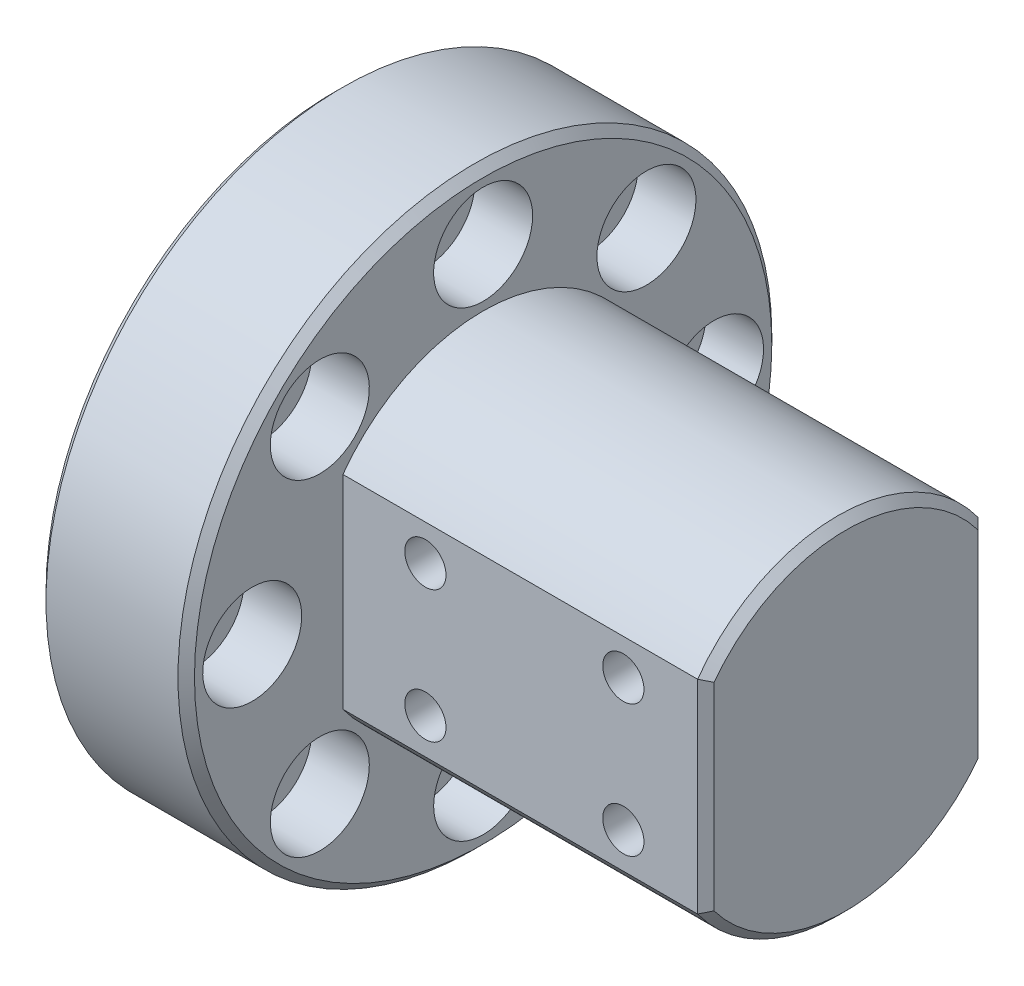
ISO-10303-21;
HEADER;
FILE_DESCRIPTION(('STEP AP214'),'2;1');
FILE_NAME('part.step','',(''),(''),'','','');
FILE_SCHEMA(('AUTOMOTIVE_DESIGN { 1 0 10303 214 1 1 1 1 }'));
ENDSEC;
DATA;
#1=APPLICATION_CONTEXT('core data for automotive mechanical design processes');
#2=APPLICATION_PROTOCOL_DEFINITION('international standard','automotive_design',2000,#1);
#3=PRODUCT_CONTEXT('',#1,'mechanical');
#4=PRODUCT('Part','Part','',(#3));
#5=PRODUCT_RELATED_PRODUCT_CATEGORY('part','',(#4));
#6=PRODUCT_DEFINITION_FORMATION('','',#4);
#7=PRODUCT_DEFINITION_CONTEXT('part definition',#1,'design');
#8=PRODUCT_DEFINITION('design','',#6,#7);
#9=PRODUCT_DEFINITION_SHAPE('','',#8);
#10=(LENGTH_UNIT() NAMED_UNIT(*) SI_UNIT(.MILLI.,.METRE.));
#11=(NAMED_UNIT(*) PLANE_ANGLE_UNIT() SI_UNIT($,.RADIAN.));
#12=(NAMED_UNIT(*) SI_UNIT($,.STERADIAN.) SOLID_ANGLE_UNIT());
#13=UNCERTAINTY_MEASURE_WITH_UNIT(LENGTH_MEASURE(1.E-05),#10,'distance_accuracy_value','');
#14=(GEOMETRIC_REPRESENTATION_CONTEXT(3) GLOBAL_UNCERTAINTY_ASSIGNED_CONTEXT((#13)) GLOBAL_UNIT_ASSIGNED_CONTEXT((#10,
#11,#12)) REPRESENTATION_CONTEXT('',''));
#15=CARTESIAN_POINT('',(0.,0.,0.));
#16=DIRECTION('',(0.,0.,1.));
#17=DIRECTION('',(1.,0.,0.));
#18=AXIS2_PLACEMENT_3D('',#15,#16,#17);
#19=CARTESIAN_POINT('',(31.,0.,0.));
#20=DIRECTION('',(-1.,0.,0.));
#21=DIRECTION('',(0.,0.,1.));
#22=AXIS2_PLACEMENT_3D('',#19,#20,#21);
#23=CYLINDRICAL_SURFACE('',#22,10.5);
#24=DIRECTION('',(-1.,0.,0.));
#25=VECTOR('',#24,1.);
#26=CARTESIAN_POINT('',(31.,-6.16441400296898,-8.5));
#27=LINE('',#26,#25);
#28=CARTESIAN_POINT('',(30.5,-6.16441400296898,-8.5));
#29=VERTEX_POINT('',#28);
#30=CARTESIAN_POINT('',(9.,-6.16441400296898,-8.5));
#31=VERTEX_POINT('',#30);
#32=EDGE_CURVE('E361',#29,#31,#27,.T.);
#33=ORIENTED_EDGE('',*,*,#32,.F.);
#34=CARTESIAN_POINT('',(30.5,0.,0.));
#35=DIRECTION('',(1.,0.,0.));
#36=DIRECTION('',(0.,0.,-1.));
#37=AXIS2_PLACEMENT_3D('',#34,#35,#36);
#38=CIRCLE('',#37,10.5);
#39=CARTESIAN_POINT('',(30.5,-6.16441400296898,8.5));
#40=VERTEX_POINT('',#39);
#41=EDGE_CURVE('E75',#29,#40,#38,.F.);
#42=ORIENTED_EDGE('',*,*,#41,.T.);
#43=DIRECTION('',(-1.,0.,0.));
#44=VECTOR('',#43,1.);
#45=CARTESIAN_POINT('',(31.,-6.16441400296898,8.5));
#46=LINE('',#45,#44);
#47=CARTESIAN_POINT('',(9.,-6.16441400296898,8.5));
#48=VERTEX_POINT('',#47);
#49=EDGE_CURVE('E112',#40,#48,#46,.T.);
#50=ORIENTED_EDGE('',*,*,#49,.T.);
#51=CARTESIAN_POINT('',(9.,0.,0.));
#52=DIRECTION('',(1.,0.,0.));
#53=DIRECTION('',(0.,0.,-1.));
#54=AXIS2_PLACEMENT_3D('',#51,#52,#53);
#55=CIRCLE('',#54,10.5);
#56=EDGE_CURVE('E120',#48,#31,#55,.T.);
#57=ORIENTED_EDGE('',*,*,#56,.T.);
#58=EDGE_LOOP('',(#33,#42,#50,#57));
#59=FACE_BOUND('',#58,.T.);
#60=ADVANCED_FACE('F45',(#59),#23,.T.);
#61=DIRECTION('',(-1.,0.,0.));
#62=VECTOR('',#61,1.);
#63=CARTESIAN_POINT('',(31.,6.16441400296898,8.5));
#64=LINE('',#63,#62);
#65=CARTESIAN_POINT('',(30.5,6.16441400296898,8.5));
#66=VERTEX_POINT('',#65);
#67=CARTESIAN_POINT('',(9.,6.16441400296898,8.5));
#68=VERTEX_POINT('',#67);
#69=EDGE_CURVE('E103',#66,#68,#64,.T.);
#70=ORIENTED_EDGE('',*,*,#69,.F.);
#71=CARTESIAN_POINT('',(30.5,0.,0.));
#72=DIRECTION('',(1.,0.,0.));
#73=DIRECTION('',(0.,0.,-1.));
#74=AXIS2_PLACEMENT_3D('',#71,#72,#73);
#75=CIRCLE('',#74,10.5);
#76=CARTESIAN_POINT('',(30.5,6.16441400296898,-8.5));
#77=VERTEX_POINT('',#76);
#78=EDGE_CURVE('E11',#66,#77,#75,.F.);
#79=ORIENTED_EDGE('',*,*,#78,.T.);
#80=DIRECTION('',(-1.,0.,0.));
#81=VECTOR('',#80,1.);
#82=CARTESIAN_POINT('',(31.,6.16441400296898,-8.5));
#83=LINE('',#82,#81);
#84=CARTESIAN_POINT('',(9.,6.16441400296898,-8.5));
#85=VERTEX_POINT('',#84);
#86=EDGE_CURVE('E121',#77,#85,#83,.T.);
#87=ORIENTED_EDGE('',*,*,#86,.T.);
#88=EDGE_CURVE('E118',#85,#68,#55,.T.);
#89=ORIENTED_EDGE('',*,*,#88,.T.);
#90=EDGE_LOOP('',(#70,#79,#87,#89));
#91=FACE_BOUND('',#90,.T.);
#92=ADVANCED_FACE('F123',(#91),#23,.T.);
#93=CARTESIAN_POINT('',(31.,0.,0.));
#94=DIRECTION('',(1.,0.,0.));
#95=DIRECTION('',(0.,0.,-1.));
#96=AXIS2_PLACEMENT_3D('',#93,#94,#95);
#97=PLANE('',#96);
#98=CARTESIAN_POINT('',(31.,0.,0.));
#99=DIRECTION('',(1.,0.,0.));
#100=DIRECTION('',(0.,0.,-1.));
#101=AXIS2_PLACEMENT_3D('',#98,#99,#100);
#102=CIRCLE('',#101,9.99999999999999);
#103=CARTESIAN_POINT('',(31.,-6.,7.99999999999999));
#104=VERTEX_POINT('',#103);
#105=CARTESIAN_POINT('',(31.,-6.,-7.99999999999999));
#106=VERTEX_POINT('',#105);
#107=EDGE_CURVE('E150',#104,#106,#102,.T.);
#108=ORIENTED_EDGE('',*,*,#107,.T.);
#109=DIRECTION('',(0.,1.,0.));
#110=VECTOR('',#109,1.);
#111=CARTESIAN_POINT('',(31.,0.,-7.99999999999999));
#112=LINE('',#111,#110);
#113=CARTESIAN_POINT('',(31.,6.,-7.99999999999999));
#114=VERTEX_POINT('',#113);
#115=EDGE_CURVE('E152',#106,#114,#112,.T.);
#116=ORIENTED_EDGE('',*,*,#115,.T.);
#117=CARTESIAN_POINT('',(31.,0.,0.));
#118=DIRECTION('',(1.,0.,0.));
#119=DIRECTION('',(0.,0.,-1.));
#120=AXIS2_PLACEMENT_3D('',#117,#118,#119);
#121=CIRCLE('',#120,9.99999999999999);
#122=CARTESIAN_POINT('',(31.,6.,7.99999999999999));
#123=VERTEX_POINT('',#122);
#124=EDGE_CURVE('E146',#114,#123,#121,.T.);
#125=ORIENTED_EDGE('',*,*,#124,.T.);
#126=DIRECTION('',(0.,-1.,0.));
#127=VECTOR('',#126,1.);
#128=CARTESIAN_POINT('',(31.,-6.16441400296898,7.99999999999999));
#129=LINE('',#128,#127);
#130=EDGE_CURVE('E148',#123,#104,#129,.T.);
#131=ORIENTED_EDGE('',*,*,#130,.T.);
#132=EDGE_LOOP('',(#108,#116,#125,#131));
#133=FACE_BOUND('',#132,.T.);
#134=ADVANCED_FACE('F205',(#133),#97,.T.);
#135=CARTESIAN_POINT('',(0.,9.89949493661165,-9.89949493661168));
#136=DIRECTION('',(1.,0.,0.));
#137=DIRECTION('',(0.,0.,-1.));
#138=AXIS2_PLACEMENT_3D('',#135,#136,#137);
#139=CYLINDRICAL_SURFACE('',#138,1.75);
#140=CARTESIAN_POINT('',(0.,9.89949493661165,-9.89949493661168));
#141=DIRECTION('',(1.,0.,0.));
#142=DIRECTION('',(0.,-0.707106781186549,-0.707106781186546));
#143=AXIS2_PLACEMENT_3D('',#140,#141,#142);
#144=CIRCLE('',#143,1.75);
#145=CARTESIAN_POINT('',(0.,8.66205806953519,-11.1369318036881));
#146=VERTEX_POINT('',#145);
#147=EDGE_CURVE('E274',#146,#146,#144,.T.);
#148=ORIENTED_EDGE('',*,*,#147,.F.);
#149=EDGE_LOOP('',(#148));
#150=FACE_BOUND('',#149,.T.);
#151=CARTESIAN_POINT('',(5.5,9.89949493661165,-9.89949493661168));
#152=DIRECTION('',(1.,0.,0.));
#153=DIRECTION('',(0.,-0.707106781186549,-0.707106781186546));
#154=AXIS2_PLACEMENT_3D('',#151,#152,#153);
#155=CIRCLE('',#154,1.75);
#156=CARTESIAN_POINT('',(5.5,8.66205806953519,-11.1369318036881));
#157=VERTEX_POINT('',#156);
#158=EDGE_CURVE('E301',#157,#157,#155,.T.);
#159=ORIENTED_EDGE('',*,*,#158,.T.);
#160=EDGE_LOOP('',(#159));
#161=FACE_BOUND('',#160,.T.);
#162=ADVANCED_FACE('F411',(#150,#161),#139,.F.);
#163=CARTESIAN_POINT('',(0.,9.89949493661179,9.89949493661154));
#164=DIRECTION('',(1.,0.,0.));
#165=DIRECTION('',(0.,0.,-1.));
#166=AXIS2_PLACEMENT_3D('',#163,#164,#165);
#167=CYLINDRICAL_SURFACE('',#166,1.75);
#168=CARTESIAN_POINT('',(0.,9.89949493661179,9.89949493661154));
#169=DIRECTION('',(1.,0.,0.));
#170=DIRECTION('',(0.,0.707106781186539,-0.707106781186556));
#171=AXIS2_PLACEMENT_3D('',#168,#169,#170);
#172=CIRCLE('',#171,1.75);
#173=CARTESIAN_POINT('',(0.,11.1369318036882,8.66205806953507));
#174=VERTEX_POINT('',#173);
#175=EDGE_CURVE('E270',#174,#174,#172,.T.);
#176=ORIENTED_EDGE('',*,*,#175,.F.);
#177=EDGE_LOOP('',(#176));
#178=FACE_BOUND('',#177,.T.);
#179=CARTESIAN_POINT('',(5.5,9.89949493661179,9.89949493661154));
#180=DIRECTION('',(1.,0.,0.));
#181=DIRECTION('',(0.,0.707106781186539,-0.707106781186556));
#182=AXIS2_PLACEMENT_3D('',#179,#180,#181);
#183=CIRCLE('',#182,1.75);
#184=CARTESIAN_POINT('',(5.5,11.1369318036882,8.66205806953507));
#185=VERTEX_POINT('',#184);
#186=EDGE_CURVE('E111',#185,#185,#183,.T.);
#187=ORIENTED_EDGE('',*,*,#186,.T.);
#188=EDGE_LOOP('',(#187));
#189=FACE_BOUND('',#188,.T.);
#190=ADVANCED_FACE('F415',(#178,#189),#167,.F.);
#191=CARTESIAN_POINT('',(0.,1.46642216231412E-13,14.));
#192=DIRECTION('',(1.,0.,0.));
#193=DIRECTION('',(0.,0.,-1.));
#194=AXIS2_PLACEMENT_3D('',#191,#192,#193);
#195=CYLINDRICAL_SURFACE('',#194,1.75);
#196=CARTESIAN_POINT('',(0.,1.46642216231412E-13,14.));
#197=DIRECTION('',(1.,0.,0.));
#198=DIRECTION('',(0.,1.,0.));
#199=AXIS2_PLACEMENT_3D('',#196,#197,#198);
#200=CIRCLE('',#199,1.75);
#201=CARTESIAN_POINT('',(0.,1.75000000000015,14.));
#202=VERTEX_POINT('',#201);
#203=EDGE_CURVE('E266',#202,#202,#200,.T.);
#204=ORIENTED_EDGE('',*,*,#203,.F.);
#205=EDGE_LOOP('',(#204));
#206=FACE_BOUND('',#205,.T.);
#207=CARTESIAN_POINT('',(5.5,1.46642216231412E-13,14.));
#208=DIRECTION('',(1.,0.,0.));
#209=DIRECTION('',(0.,1.,0.));
#210=AXIS2_PLACEMENT_3D('',#207,#208,#209);
#211=CIRCLE('',#210,1.75);
#212=CARTESIAN_POINT('',(5.5,1.75000000000015,14.));
#213=VERTEX_POINT('',#212);
#214=EDGE_CURVE('E349',#213,#213,#211,.T.);
#215=ORIENTED_EDGE('',*,*,#214,.T.);
#216=EDGE_LOOP('',(#215));
#217=FACE_BOUND('',#216,.T.);
#218=ADVANCED_FACE('F422',(#206,#217),#195,.F.);
#219=CARTESIAN_POINT('',(0.,-9.89949493661158,9.89949493661175));
#220=DIRECTION('',(1.,0.,0.));
#221=DIRECTION('',(0.,0.,-1.));
#222=AXIS2_PLACEMENT_3D('',#219,#220,#221);
#223=CYLINDRICAL_SURFACE('',#222,1.75);
#224=CARTESIAN_POINT('',(0.,-9.89949493661158,9.89949493661175));
#225=DIRECTION('',(1.,0.,0.));
#226=DIRECTION('',(0.,0.707106781186554,0.707106781186541));
#227=AXIS2_PLACEMENT_3D('',#224,#225,#226);
#228=CIRCLE('',#227,1.75);
#229=CARTESIAN_POINT('',(0.,-8.66205806953511,11.1369318036882));
#230=VERTEX_POINT('',#229);
#231=EDGE_CURVE('E262',#230,#230,#228,.T.);
#232=ORIENTED_EDGE('',*,*,#231,.F.);
#233=EDGE_LOOP('',(#232));
#234=FACE_BOUND('',#233,.T.);
#235=CARTESIAN_POINT('',(5.5,-9.89949493661158,9.89949493661175));
#236=DIRECTION('',(1.,0.,0.));
#237=DIRECTION('',(0.,0.707106781186554,0.707106781186541));
#238=AXIS2_PLACEMENT_3D('',#235,#236,#237);
#239=CIRCLE('',#238,1.75);
#240=CARTESIAN_POINT('',(5.5,-8.66205806953511,11.1369318036882));
#241=VERTEX_POINT('',#240);
#242=EDGE_CURVE('E311',#241,#241,#239,.T.);
#243=ORIENTED_EDGE('',*,*,#242,.T.);
#244=EDGE_LOOP('',(#243));
#245=FACE_BOUND('',#244,.T.);
#246=ADVANCED_FACE('F428',(#234,#245),#223,.F.);
#247=CARTESIAN_POINT('',(0.,-14.,0.));
#248=DIRECTION('',(1.,0.,0.));
#249=DIRECTION('',(0.,0.,-1.));
#250=AXIS2_PLACEMENT_3D('',#247,#248,#249);
#251=CYLINDRICAL_SURFACE('',#250,1.75);
#252=CARTESIAN_POINT('',(0.,-14.,0.));
#253=DIRECTION('',(1.,0.,0.));
#254=DIRECTION('',(0.,0.,1.));
#255=AXIS2_PLACEMENT_3D('',#252,#253,#254);
#256=CIRCLE('',#255,1.75);
#257=CARTESIAN_POINT('',(0.,-14.,1.75));
#258=VERTEX_POINT('',#257);
#259=EDGE_CURVE('E258',#258,#258,#256,.T.);
#260=ORIENTED_EDGE('',*,*,#259,.F.);
#261=EDGE_LOOP('',(#260));
#262=FACE_BOUND('',#261,.T.);
#263=CARTESIAN_POINT('',(5.5,-14.,0.));
#264=DIRECTION('',(1.,0.,0.));
#265=DIRECTION('',(0.,0.,1.));
#266=AXIS2_PLACEMENT_3D('',#263,#264,#265);
#267=CIRCLE('',#266,1.75);
#268=CARTESIAN_POINT('',(5.5,-14.,1.75));
#269=VERTEX_POINT('',#268);
#270=EDGE_CURVE('E314',#269,#269,#267,.T.);
#271=ORIENTED_EDGE('',*,*,#270,.T.);
#272=EDGE_LOOP('',(#271));
#273=FACE_BOUND('',#272,.T.);
#274=ADVANCED_FACE('F450',(#262,#273),#251,.F.);
#275=CARTESIAN_POINT('',(0.,-9.89949493661172,-9.89949493661161));
#276=DIRECTION('',(1.,0.,0.));
#277=DIRECTION('',(0.,0.,-1.));
#278=AXIS2_PLACEMENT_3D('',#275,#276,#277);
#279=CYLINDRICAL_SURFACE('',#278,1.75);
#280=CARTESIAN_POINT('',(0.,-9.89949493661172,-9.89949493661161));
#281=DIRECTION('',(1.,0.,0.));
#282=DIRECTION('',(0.,-0.707106781186544,0.707106781186551));
#283=AXIS2_PLACEMENT_3D('',#280,#281,#282);
#284=CIRCLE('',#283,1.75);
#285=CARTESIAN_POINT('',(0.,-11.1369318036882,-8.66205806953515));
#286=VERTEX_POINT('',#285);
#287=EDGE_CURVE('E254',#286,#286,#284,.T.);
#288=ORIENTED_EDGE('',*,*,#287,.F.);
#289=EDGE_LOOP('',(#288));
#290=FACE_BOUND('',#289,.T.);
#291=CARTESIAN_POINT('',(5.5,-9.89949493661172,-9.89949493661161));
#292=DIRECTION('',(1.,0.,0.));
#293=DIRECTION('',(0.,-0.707106781186544,0.707106781186551));
#294=AXIS2_PLACEMENT_3D('',#291,#292,#293);
#295=CIRCLE('',#294,1.75);
#296=CARTESIAN_POINT('',(5.5,-11.1369318036882,-8.66205806953515));
#297=VERTEX_POINT('',#296);
#298=EDGE_CURVE('E324',#297,#297,#295,.T.);
#299=ORIENTED_EDGE('',*,*,#298,.T.);
#300=EDGE_LOOP('',(#299));
#301=FACE_BOUND('',#300,.T.);
#302=ADVANCED_FACE('F442',(#290,#301),#279,.F.);
#303=CARTESIAN_POINT('',(0.,0.,-14.));
#304=DIRECTION('',(1.,0.,0.));
#305=DIRECTION('',(0.,0.,-1.));
#306=AXIS2_PLACEMENT_3D('',#303,#304,#305);
#307=CYLINDRICAL_SURFACE('',#306,1.75);
#308=CARTESIAN_POINT('',(0.,0.,-14.));
#309=DIRECTION('',(1.,0.,0.));
#310=DIRECTION('',(0.,-1.,0.));
#311=AXIS2_PLACEMENT_3D('',#308,#309,#310);
#312=CIRCLE('',#311,1.75);
#313=CARTESIAN_POINT('',(0.,-1.75000000000005,-14.));
#314=VERTEX_POINT('',#313);
#315=EDGE_CURVE('E250',#314,#314,#312,.T.);
#316=ORIENTED_EDGE('',*,*,#315,.F.);
#317=EDGE_LOOP('',(#316));
#318=FACE_BOUND('',#317,.T.);
#319=CARTESIAN_POINT('',(5.5,0.,-14.));
#320=DIRECTION('',(1.,0.,0.));
#321=DIRECTION('',(0.,-1.,0.));
#322=AXIS2_PLACEMENT_3D('',#319,#320,#321);
#323=CIRCLE('',#322,1.75);
#324=CARTESIAN_POINT('',(5.5,-1.75000000000005,-14.));
#325=VERTEX_POINT('',#324);
#326=EDGE_CURVE('E333',#325,#325,#323,.T.);
#327=ORIENTED_EDGE('',*,*,#326,.T.);
#328=EDGE_LOOP('',(#327));
#329=FACE_BOUND('',#328,.T.);
#330=ADVANCED_FACE('F438',(#318,#329),#307,.F.);
#331=CARTESIAN_POINT('',(0.,14.,0.));
#332=DIRECTION('',(1.,0.,0.));
#333=DIRECTION('',(0.,0.,-1.));
#334=AXIS2_PLACEMENT_3D('',#331,#332,#333);
#335=CYLINDRICAL_SURFACE('',#334,1.75);
#336=CARTESIAN_POINT('',(0.,14.,0.));
#337=DIRECTION('',(1.,0.,0.));
#338=DIRECTION('',(0.,0.,-1.));
#339=AXIS2_PLACEMENT_3D('',#336,#337,#338);
#340=CIRCLE('',#339,1.75);
#341=CARTESIAN_POINT('',(0.,14.,-1.75));
#342=VERTEX_POINT('',#341);
#343=EDGE_CURVE('E131',#342,#342,#340,.T.);
#344=ORIENTED_EDGE('',*,*,#343,.F.);
#345=EDGE_LOOP('',(#344));
#346=FACE_BOUND('',#345,.T.);
#347=CARTESIAN_POINT('',(5.5,14.,0.));
#348=DIRECTION('',(1.,0.,0.));
#349=DIRECTION('',(0.,0.,-1.));
#350=AXIS2_PLACEMENT_3D('',#347,#348,#349);
#351=CIRCLE('',#350,1.75);
#352=CARTESIAN_POINT('',(5.5,14.,-1.75));
#353=VERTEX_POINT('',#352);
#354=EDGE_CURVE('E285',#353,#353,#351,.T.);
#355=ORIENTED_EDGE('',*,*,#354,.T.);
#356=EDGE_LOOP('',(#355));
#357=FACE_BOUND('',#356,.T.);
#358=ADVANCED_FACE('F220',(#346,#357),#335,.F.);
#359=CARTESIAN_POINT('',(9.,0.,0.));
#360=DIRECTION('',(-1.,0.,0.));
#361=DIRECTION('',(0.,0.,1.));
#362=AXIS2_PLACEMENT_3D('',#359,#360,#361);
#363=CYLINDRICAL_SURFACE('',#362,18.);
#364=CARTESIAN_POINT('',(8.5,0.,0.));
#365=DIRECTION('',(1.,0.,0.));
#366=DIRECTION('',(0.,0.,-1.));
#367=AXIS2_PLACEMENT_3D('',#364,#365,#366);
#368=CIRCLE('',#367,18.);
#369=CARTESIAN_POINT('',(8.5,0.,-18.));
#370=VERTEX_POINT('',#369);
#371=EDGE_CURVE('E137',#370,#370,#368,.F.);
#372=ORIENTED_EDGE('',*,*,#371,.T.);
#373=EDGE_LOOP('',(#372));
#374=FACE_BOUND('',#373,.T.);
#375=CARTESIAN_POINT('',(0.499999999999997,0.,0.));
#376=DIRECTION('',(1.,0.,0.));
#377=DIRECTION('',(0.,0.,-1.));
#378=AXIS2_PLACEMENT_3D('',#375,#376,#377);
#379=CIRCLE('',#378,18.);
#380=CARTESIAN_POINT('',(0.499999999999997,0.,-18.));
#381=VERTEX_POINT('',#380);
#382=EDGE_CURVE('E129',#381,#381,#379,.T.);
#383=ORIENTED_EDGE('',*,*,#382,.T.);
#384=EDGE_LOOP('',(#383));
#385=FACE_BOUND('',#384,.T.);
#386=ADVANCED_FACE('F212',(#374,#385),#363,.T.);
#387=CARTESIAN_POINT('',(9.,0.,0.));
#388=DIRECTION('',(1.,0.,0.));
#389=DIRECTION('',(0.,0.,-1.));
#390=AXIS2_PLACEMENT_3D('',#387,#388,#389);
#391=PLANE('',#390);
#392=CARTESIAN_POINT('',(9.,0.,0.));
#393=DIRECTION('',(1.,0.,0.));
#394=DIRECTION('',(0.,0.,-1.));
#395=AXIS2_PLACEMENT_3D('',#392,#393,#394);
#396=CIRCLE('',#395,17.5);
#397=CARTESIAN_POINT('',(9.,0.,-17.5));
#398=VERTEX_POINT('',#397);
#399=EDGE_CURVE('E126',#398,#398,#396,.T.);
#400=ORIENTED_EDGE('',*,*,#399,.T.);
#401=EDGE_LOOP('',(#400));
#402=FACE_BOUND('',#401,.T.);
#403=CARTESIAN_POINT('',(9.,0.,-14.));
#404=DIRECTION('',(1.,0.,0.));
#405=DIRECTION('',(0.,-1.,0.));
#406=AXIS2_PLACEMENT_3D('',#403,#404,#405);
#407=CIRCLE('',#406,3.);
#408=CARTESIAN_POINT('',(9.,-3.00000000000005,-14.));
#409=VERTEX_POINT('',#408);
#410=EDGE_CURVE('E336',#409,#409,#407,.T.);
#411=ORIENTED_EDGE('',*,*,#410,.F.);
#412=EDGE_LOOP('',(#411));
#413=FACE_BOUND('',#412,.T.);
#414=CARTESIAN_POINT('',(9.,-9.89949493661172,-9.89949493661161));
#415=DIRECTION('',(1.,0.,0.));
#416=DIRECTION('',(0.,-0.707106781186544,0.707106781186551));
#417=AXIS2_PLACEMENT_3D('',#414,#415,#416);
#418=CIRCLE('',#417,3.);
#419=CARTESIAN_POINT('',(9.,-12.0208152801713,-7.77817459305196));
#420=VERTEX_POINT('',#419);
#421=EDGE_CURVE('E327',#420,#420,#418,.T.);
#422=ORIENTED_EDGE('',*,*,#421,.F.);
#423=EDGE_LOOP('',(#422));
#424=FACE_BOUND('',#423,.T.);
#425=CARTESIAN_POINT('',(9.,-14.,0.));
#426=DIRECTION('',(1.,0.,0.));
#427=DIRECTION('',(0.,0.,1.));
#428=AXIS2_PLACEMENT_3D('',#425,#426,#427);
#429=CIRCLE('',#428,3.);
#430=CARTESIAN_POINT('',(9.,-14.,3.));
#431=VERTEX_POINT('',#430);
#432=EDGE_CURVE('E318',#431,#431,#429,.T.);
#433=ORIENTED_EDGE('',*,*,#432,.F.);
#434=EDGE_LOOP('',(#433));
#435=FACE_BOUND('',#434,.T.);
#436=CARTESIAN_POINT('',(9.,-9.89949493661158,9.89949493661175));
#437=DIRECTION('',(1.,0.,0.));
#438=DIRECTION('',(0.,0.707106781186554,0.707106781186541));
#439=AXIS2_PLACEMENT_3D('',#436,#437,#438);
#440=CIRCLE('',#439,3.);
#441=CARTESIAN_POINT('',(9.,-7.77817459305192,12.0208152801714));
#442=VERTEX_POINT('',#441);
#443=EDGE_CURVE('E307',#442,#442,#440,.T.);
#444=ORIENTED_EDGE('',*,*,#443,.F.);
#445=EDGE_LOOP('',(#444));
#446=FACE_BOUND('',#445,.T.);
#447=CARTESIAN_POINT('',(9.,1.46642216231412E-13,14.));
#448=DIRECTION('',(1.,0.,0.));
#449=DIRECTION('',(0.,1.,0.));
#450=AXIS2_PLACEMENT_3D('',#447,#448,#449);
#451=CIRCLE('',#450,3.);
#452=CARTESIAN_POINT('',(9.,3.00000000000015,14.));
#453=VERTEX_POINT('',#452);
#454=EDGE_CURVE('E352',#453,#453,#451,.T.);
#455=ORIENTED_EDGE('',*,*,#454,.F.);
#456=EDGE_LOOP('',(#455));
#457=FACE_BOUND('',#456,.T.);
#458=CARTESIAN_POINT('',(9.,9.89949493661179,9.89949493661154));
#459=DIRECTION('',(1.,0.,0.));
#460=DIRECTION('',(0.,0.707106781186539,-0.707106781186556));
#461=AXIS2_PLACEMENT_3D('',#458,#459,#460);
#462=CIRCLE('',#461,3.);
#463=CARTESIAN_POINT('',(9.,12.0208152801714,7.77817459305188));
#464=VERTEX_POINT('',#463);
#465=EDGE_CURVE('E343',#464,#464,#462,.T.);
#466=ORIENTED_EDGE('',*,*,#465,.F.);
#467=EDGE_LOOP('',(#466));
#468=FACE_BOUND('',#467,.T.);
#469=CARTESIAN_POINT('',(9.,9.89949493661165,-9.89949493661168));
#470=DIRECTION('',(1.,0.,0.));
#471=DIRECTION('',(0.,-0.707106781186549,-0.707106781186546));
#472=AXIS2_PLACEMENT_3D('',#469,#470,#471);
#473=CIRCLE('',#472,3.);
#474=CARTESIAN_POINT('',(9.,7.778174593052,-12.0208152801713));
#475=VERTEX_POINT('',#474);
#476=EDGE_CURVE('E298',#475,#475,#473,.T.);
#477=ORIENTED_EDGE('',*,*,#476,.F.);
#478=EDGE_LOOP('',(#477));
#479=FACE_BOUND('',#478,.T.);
#480=CARTESIAN_POINT('',(9.,14.,0.));
#481=DIRECTION('',(1.,0.,0.));
#482=DIRECTION('',(0.,0.,-1.));
#483=AXIS2_PLACEMENT_3D('',#480,#481,#482);
#484=CIRCLE('',#483,3.);
#485=CARTESIAN_POINT('',(9.,14.,-3.));
#486=VERTEX_POINT('',#485);
#487=EDGE_CURVE('E280',#486,#486,#484,.T.);
#488=ORIENTED_EDGE('',*,*,#487,.F.);
#489=EDGE_LOOP('',(#488));
#490=FACE_BOUND('',#489,.T.);
#491=ORIENTED_EDGE('',*,*,#88,.F.);
#492=DIRECTION('',(0.,-1.,0.));
#493=VECTOR('',#492,1.);
#494=CARTESIAN_POINT('',(9.,0.,-8.5));
#495=LINE('',#494,#493);
#496=EDGE_CURVE('E363',#85,#31,#495,.T.);
#497=ORIENTED_EDGE('',*,*,#496,.T.);
#498=ORIENTED_EDGE('',*,*,#56,.F.);
#499=DIRECTION('',(0.,-1.,0.));
#500=VECTOR('',#499,1.);
#501=CARTESIAN_POINT('',(9.,0.,8.5));
#502=LINE('',#501,#500);
#503=EDGE_CURVE('E106',#68,#48,#502,.T.);
#504=ORIENTED_EDGE('',*,*,#503,.F.);
#505=EDGE_LOOP('',(#491,#497,#498,#504));
#506=FACE_BOUND('',#505,.T.);
#507=ADVANCED_FACE('F116',(#402,#413,#424,#435,#446,#457,#468,#479,#490,#506),#391,.T.);
#508=CARTESIAN_POINT('',(0.,0.,0.));
#509=DIRECTION('',(1.,0.,0.));
#510=DIRECTION('',(0.,0.,-1.));
#511=AXIS2_PLACEMENT_3D('',#508,#509,#510);
#512=PLANE('',#511);
#513=CARTESIAN_POINT('',(0.,0.,0.));
#514=DIRECTION('',(1.,0.,0.));
#515=DIRECTION('',(0.,0.,-1.));
#516=AXIS2_PLACEMENT_3D('',#513,#514,#515);
#517=CIRCLE('',#516,17.5);
#518=CARTESIAN_POINT('',(0.,0.,-17.5));
#519=VERTEX_POINT('',#518);
#520=EDGE_CURVE('E140',#519,#519,#517,.F.);
#521=ORIENTED_EDGE('',*,*,#520,.T.);
#522=EDGE_LOOP('',(#521));
#523=FACE_BOUND('',#522,.T.);
#524=ORIENTED_EDGE('',*,*,#315,.T.);
#525=EDGE_LOOP('',(#524));
#526=FACE_BOUND('',#525,.T.);
#527=ORIENTED_EDGE('',*,*,#287,.T.);
#528=EDGE_LOOP('',(#527));
#529=FACE_BOUND('',#528,.T.);
#530=ORIENTED_EDGE('',*,*,#259,.T.);
#531=EDGE_LOOP('',(#530));
#532=FACE_BOUND('',#531,.T.);
#533=ORIENTED_EDGE('',*,*,#231,.T.);
#534=EDGE_LOOP('',(#533));
#535=FACE_BOUND('',#534,.T.);
#536=ORIENTED_EDGE('',*,*,#203,.T.);
#537=EDGE_LOOP('',(#536));
#538=FACE_BOUND('',#537,.T.);
#539=ORIENTED_EDGE('',*,*,#175,.T.);
#540=EDGE_LOOP('',(#539));
#541=FACE_BOUND('',#540,.T.);
#542=ORIENTED_EDGE('',*,*,#147,.T.);
#543=EDGE_LOOP('',(#542));
#544=FACE_BOUND('',#543,.T.);
#545=ORIENTED_EDGE('',*,*,#343,.T.);
#546=EDGE_LOOP('',(#545));
#547=FACE_BOUND('',#546,.T.);
#548=ADVANCED_FACE('F211',(#523,#526,#529,#532,#535,#538,#541,#544,#547),#512,.F.);
#549=CARTESIAN_POINT('',(5.5,14.,0.));
#550=DIRECTION('',(1.,0.,0.));
#551=DIRECTION('',(0.,0.,-1.));
#552=AXIS2_PLACEMENT_3D('',#549,#550,#551);
#553=CYLINDRICAL_SURFACE('',#552,3.);
#554=CARTESIAN_POINT('',(5.5,14.,0.));
#555=DIRECTION('',(1.,0.,0.));
#556=DIRECTION('',(0.,0.,-1.));
#557=AXIS2_PLACEMENT_3D('',#554,#555,#556);
#558=CIRCLE('',#557,3.);
#559=CARTESIAN_POINT('',(5.5,14.,-3.));
#560=VERTEX_POINT('',#559);
#561=EDGE_CURVE('E278',#560,#560,#558,.T.);
#562=ORIENTED_EDGE('',*,*,#561,.F.);
#563=EDGE_LOOP('',(#562));
#564=FACE_BOUND('',#563,.T.);
#565=ORIENTED_EDGE('',*,*,#487,.T.);
#566=EDGE_LOOP('',(#565));
#567=FACE_BOUND('',#566,.T.);
#568=ADVANCED_FACE('F216',(#564,#567),#553,.F.);
#569=CARTESIAN_POINT('',(5.5,14.,0.));
#570=DIRECTION('',(1.,0.,0.));
#571=DIRECTION('',(0.,0.,-1.));
#572=AXIS2_PLACEMENT_3D('',#569,#570,#571);
#573=PLANE('',#572);
#574=ORIENTED_EDGE('',*,*,#354,.F.);
#575=EDGE_LOOP('',(#574));
#576=FACE_BOUND('',#575,.T.);
#577=ORIENTED_EDGE('',*,*,#561,.T.);
#578=EDGE_LOOP('',(#577));
#579=FACE_BOUND('',#578,.T.);
#580=ADVANCED_FACE('F430',(#576,#579),#573,.T.);
#581=CARTESIAN_POINT('',(5.5,0.,-14.));
#582=DIRECTION('',(1.,0.,0.));
#583=DIRECTION('',(0.,0.,-1.));
#584=AXIS2_PLACEMENT_3D('',#581,#582,#583);
#585=CYLINDRICAL_SURFACE('',#584,3.);
#586=CARTESIAN_POINT('',(5.5,0.,-14.));
#587=DIRECTION('',(1.,0.,0.));
#588=DIRECTION('',(0.,-1.,0.));
#589=AXIS2_PLACEMENT_3D('',#586,#587,#588);
#590=CIRCLE('',#589,3.);
#591=CARTESIAN_POINT('',(5.5,-3.00000000000005,-14.));
#592=VERTEX_POINT('',#591);
#593=EDGE_CURVE('E306',#592,#592,#590,.T.);
#594=ORIENTED_EDGE('',*,*,#593,.F.);
#595=EDGE_LOOP('',(#594));
#596=FACE_BOUND('',#595,.T.);
#597=ORIENTED_EDGE('',*,*,#410,.T.);
#598=EDGE_LOOP('',(#597));
#599=FACE_BOUND('',#598,.T.);
#600=ADVANCED_FACE('F433',(#596,#599),#585,.F.);
#601=CARTESIAN_POINT('',(5.5,0.,-14.));
#602=DIRECTION('',(1.,0.,0.));
#603=DIRECTION('',(0.,-1.,0.));
#604=AXIS2_PLACEMENT_3D('',#601,#602,#603);
#605=PLANE('',#604);
#606=ORIENTED_EDGE('',*,*,#326,.F.);
#607=EDGE_LOOP('',(#606));
#608=FACE_BOUND('',#607,.T.);
#609=ORIENTED_EDGE('',*,*,#593,.T.);
#610=EDGE_LOOP('',(#609));
#611=FACE_BOUND('',#610,.T.);
#612=ADVANCED_FACE('F533',(#608,#611),#605,.T.);
#613=CARTESIAN_POINT('',(5.5,-9.89949493661172,-9.89949493661161));
#614=DIRECTION('',(1.,0.,0.));
#615=DIRECTION('',(0.,0.,-1.));
#616=AXIS2_PLACEMENT_3D('',#613,#614,#615);
#617=CYLINDRICAL_SURFACE('',#616,3.);
#618=CARTESIAN_POINT('',(5.5,-9.89949493661172,-9.89949493661161));
#619=DIRECTION('',(1.,0.,0.));
#620=DIRECTION('',(0.,-0.707106781186544,0.707106781186551));
#621=AXIS2_PLACEMENT_3D('',#618,#619,#620);
#622=CIRCLE('',#621,3.);
#623=CARTESIAN_POINT('',(5.5,-12.0208152801713,-7.77817459305196));
#624=VERTEX_POINT('',#623);
#625=EDGE_CURVE('E330',#624,#624,#622,.T.);
#626=ORIENTED_EDGE('',*,*,#625,.F.);
#627=EDGE_LOOP('',(#626));
#628=FACE_BOUND('',#627,.T.);
#629=ORIENTED_EDGE('',*,*,#421,.T.);
#630=EDGE_LOOP('',(#629));
#631=FACE_BOUND('',#630,.T.);
#632=ADVANCED_FACE('F536',(#628,#631),#617,.F.);
#633=CARTESIAN_POINT('',(5.5,-9.89949493661172,-9.89949493661161));
#634=DIRECTION('',(1.,0.,0.));
#635=DIRECTION('',(0.,-0.707106781186544,0.707106781186551));
#636=AXIS2_PLACEMENT_3D('',#633,#634,#635);
#637=PLANE('',#636);
#638=ORIENTED_EDGE('',*,*,#298,.F.);
#639=EDGE_LOOP('',(#638));
#640=FACE_BOUND('',#639,.T.);
#641=ORIENTED_EDGE('',*,*,#625,.T.);
#642=EDGE_LOOP('',(#641));
#643=FACE_BOUND('',#642,.T.);
#644=ADVANCED_FACE('F474',(#640,#643),#637,.T.);
#645=CARTESIAN_POINT('',(5.5,-14.,0.));
#646=DIRECTION('',(1.,0.,0.));
#647=DIRECTION('',(0.,0.,-1.));
#648=AXIS2_PLACEMENT_3D('',#645,#646,#647);
#649=CYLINDRICAL_SURFACE('',#648,3.);
#650=CARTESIAN_POINT('',(5.5,-14.,0.));
#651=DIRECTION('',(1.,0.,0.));
#652=DIRECTION('',(0.,0.,1.));
#653=AXIS2_PLACEMENT_3D('',#650,#651,#652);
#654=CIRCLE('',#653,3.);
#655=CARTESIAN_POINT('',(5.5,-14.,3.));
#656=VERTEX_POINT('',#655);
#657=EDGE_CURVE('E321',#656,#656,#654,.T.);
#658=ORIENTED_EDGE('',*,*,#657,.F.);
#659=EDGE_LOOP('',(#658));
#660=FACE_BOUND('',#659,.T.);
#661=ORIENTED_EDGE('',*,*,#432,.T.);
#662=EDGE_LOOP('',(#661));
#663=FACE_BOUND('',#662,.T.);
#664=ADVANCED_FACE('F468',(#660,#663),#649,.F.);
#665=CARTESIAN_POINT('',(5.5,-14.,0.));
#666=DIRECTION('',(1.,0.,0.));
#667=DIRECTION('',(0.,0.,1.));
#668=AXIS2_PLACEMENT_3D('',#665,#666,#667);
#669=PLANE('',#668);
#670=ORIENTED_EDGE('',*,*,#270,.F.);
#671=EDGE_LOOP('',(#670));
#672=FACE_BOUND('',#671,.T.);
#673=ORIENTED_EDGE('',*,*,#657,.T.);
#674=EDGE_LOOP('',(#673));
#675=FACE_BOUND('',#674,.T.);
#676=ADVANCED_FACE('F464',(#672,#675),#669,.T.);
#677=CARTESIAN_POINT('',(5.5,-9.89949493661158,9.89949493661175));
#678=DIRECTION('',(1.,0.,0.));
#679=DIRECTION('',(0.,0.,-1.));
#680=AXIS2_PLACEMENT_3D('',#677,#678,#679);
#681=CYLINDRICAL_SURFACE('',#680,3.);
#682=CARTESIAN_POINT('',(5.5,-9.89949493661158,9.89949493661175));
#683=DIRECTION('',(1.,0.,0.));
#684=DIRECTION('',(0.,0.707106781186554,0.707106781186541));
#685=AXIS2_PLACEMENT_3D('',#682,#683,#684);
#686=CIRCLE('',#685,3.);
#687=CARTESIAN_POINT('',(5.5,-7.77817459305192,12.0208152801714));
#688=VERTEX_POINT('',#687);
#689=EDGE_CURVE('E310',#688,#688,#686,.T.);
#690=ORIENTED_EDGE('',*,*,#689,.F.);
#691=EDGE_LOOP('',(#690));
#692=FACE_BOUND('',#691,.T.);
#693=ORIENTED_EDGE('',*,*,#443,.T.);
#694=EDGE_LOOP('',(#693));
#695=FACE_BOUND('',#694,.T.);
#696=ADVANCED_FACE('F467',(#692,#695),#681,.F.);
#697=CARTESIAN_POINT('',(5.5,-9.89949493661158,9.89949493661175));
#698=DIRECTION('',(1.,0.,0.));
#699=DIRECTION('',(0.,0.707106781186554,0.707106781186541));
#700=AXIS2_PLACEMENT_3D('',#697,#698,#699);
#701=PLANE('',#700);
#702=ORIENTED_EDGE('',*,*,#242,.F.);
#703=EDGE_LOOP('',(#702));
#704=FACE_BOUND('',#703,.T.);
#705=ORIENTED_EDGE('',*,*,#689,.T.);
#706=EDGE_LOOP('',(#705));
#707=FACE_BOUND('',#706,.T.);
#708=ADVANCED_FACE('F522',(#704,#707),#701,.T.);
#709=CARTESIAN_POINT('',(5.5,1.46642216231412E-13,14.));
#710=DIRECTION('',(1.,0.,0.));
#711=DIRECTION('',(0.,0.,-1.));
#712=AXIS2_PLACEMENT_3D('',#709,#710,#711);
#713=CYLINDRICAL_SURFACE('',#712,3.);
#714=CARTESIAN_POINT('',(5.5,1.46642216231412E-13,14.));
#715=DIRECTION('',(1.,0.,0.));
#716=DIRECTION('',(0.,1.,0.));
#717=AXIS2_PLACEMENT_3D('',#714,#715,#716);
#718=CIRCLE('',#717,3.);
#719=CARTESIAN_POINT('',(5.5,3.00000000000015,14.));
#720=VERTEX_POINT('',#719);
#721=EDGE_CURVE('E317',#720,#720,#718,.T.);
#722=ORIENTED_EDGE('',*,*,#721,.F.);
#723=EDGE_LOOP('',(#722));
#724=FACE_BOUND('',#723,.T.);
#725=ORIENTED_EDGE('',*,*,#454,.T.);
#726=EDGE_LOOP('',(#725));
#727=FACE_BOUND('',#726,.T.);
#728=ADVANCED_FACE('F516',(#724,#727),#713,.F.);
#729=CARTESIAN_POINT('',(5.5,1.46642216231412E-13,14.));
#730=DIRECTION('',(1.,0.,0.));
#731=DIRECTION('',(0.,1.,0.));
#732=AXIS2_PLACEMENT_3D('',#729,#730,#731);
#733=PLANE('',#732);
#734=ORIENTED_EDGE('',*,*,#214,.F.);
#735=EDGE_LOOP('',(#734));
#736=FACE_BOUND('',#735,.T.);
#737=ORIENTED_EDGE('',*,*,#721,.T.);
#738=EDGE_LOOP('',(#737));
#739=FACE_BOUND('',#738,.T.);
#740=ADVANCED_FACE('F513',(#736,#739),#733,.T.);
#741=CARTESIAN_POINT('',(5.5,9.89949493661179,9.89949493661154));
#742=DIRECTION('',(1.,0.,0.));
#743=DIRECTION('',(0.,0.,-1.));
#744=AXIS2_PLACEMENT_3D('',#741,#742,#743);
#745=CYLINDRICAL_SURFACE('',#744,3.);
#746=CARTESIAN_POINT('',(5.5,9.89949493661179,9.89949493661154));
#747=DIRECTION('',(1.,0.,0.));
#748=DIRECTION('',(0.,0.707106781186539,-0.707106781186556));
#749=AXIS2_PLACEMENT_3D('',#746,#747,#748);
#750=CIRCLE('',#749,3.);
#751=CARTESIAN_POINT('',(5.5,12.0208152801714,7.77817459305188));
#752=VERTEX_POINT('',#751);
#753=EDGE_CURVE('E346',#752,#752,#750,.T.);
#754=ORIENTED_EDGE('',*,*,#753,.F.);
#755=EDGE_LOOP('',(#754));
#756=FACE_BOUND('',#755,.T.);
#757=ORIENTED_EDGE('',*,*,#465,.T.);
#758=EDGE_LOOP('',(#757));
#759=FACE_BOUND('',#758,.T.);
#760=ADVANCED_FACE('F501',(#756,#759),#745,.F.);
#761=CARTESIAN_POINT('',(5.5,9.89949493661179,9.89949493661154));
#762=DIRECTION('',(1.,0.,0.));
#763=DIRECTION('',(0.,0.707106781186539,-0.707106781186556));
#764=AXIS2_PLACEMENT_3D('',#761,#762,#763);
#765=PLANE('',#764);
#766=ORIENTED_EDGE('',*,*,#186,.F.);
#767=EDGE_LOOP('',(#766));
#768=FACE_BOUND('',#767,.T.);
#769=ORIENTED_EDGE('',*,*,#753,.T.);
#770=EDGE_LOOP('',(#769));
#771=FACE_BOUND('',#770,.T.);
#772=ADVANCED_FACE('F492',(#768,#771),#765,.T.);
#773=CARTESIAN_POINT('',(5.5,9.89949493661165,-9.89949493661168));
#774=DIRECTION('',(1.,0.,0.));
#775=DIRECTION('',(0.,0.,-1.));
#776=AXIS2_PLACEMENT_3D('',#773,#774,#775);
#777=CYLINDRICAL_SURFACE('',#776,3.);
#778=CARTESIAN_POINT('',(5.5,9.89949493661165,-9.89949493661168));
#779=DIRECTION('',(1.,0.,0.));
#780=DIRECTION('',(0.,-0.707106781186549,-0.707106781186546));
#781=AXIS2_PLACEMENT_3D('',#778,#779,#780);
#782=CIRCLE('',#781,3.);
#783=CARTESIAN_POINT('',(5.5,7.778174593052,-12.0208152801713));
#784=VERTEX_POINT('',#783);
#785=EDGE_CURVE('E296',#784,#784,#782,.T.);
#786=ORIENTED_EDGE('',*,*,#785,.F.);
#787=EDGE_LOOP('',(#786));
#788=FACE_BOUND('',#787,.T.);
#789=ORIENTED_EDGE('',*,*,#476,.T.);
#790=EDGE_LOOP('',(#789));
#791=FACE_BOUND('',#790,.T.);
#792=ADVANCED_FACE('F490',(#788,#791),#777,.F.);
#793=CARTESIAN_POINT('',(5.5,9.89949493661165,-9.89949493661168));
#794=DIRECTION('',(1.,0.,0.));
#795=DIRECTION('',(0.,-0.707106781186549,-0.707106781186546));
#796=AXIS2_PLACEMENT_3D('',#793,#794,#795);
#797=PLANE('',#796);
#798=ORIENTED_EDGE('',*,*,#158,.F.);
#799=EDGE_LOOP('',(#798));
#800=FACE_BOUND('',#799,.T.);
#801=ORIENTED_EDGE('',*,*,#785,.T.);
#802=EDGE_LOOP('',(#801));
#803=FACE_BOUND('',#802,.T.);
#804=ADVANCED_FACE('F229',(#800,#803),#797,.T.);
#805=CARTESIAN_POINT('',(9.,0.,0.));
#806=DIRECTION('',(-1.,0.,0.));
#807=DIRECTION('',(0.,0.,1.));
#808=AXIS2_PLACEMENT_3D('',#805,#806,#807);
#809=CONICAL_SURFACE('',#808,17.5,0.785398163397441);
#810=ORIENTED_EDGE('',*,*,#371,.F.);
#811=EDGE_LOOP('',(#810));
#812=FACE_BOUND('',#811,.T.);
#813=ORIENTED_EDGE('',*,*,#399,.F.);
#814=EDGE_LOOP('',(#813));
#815=FACE_BOUND('',#814,.T.);
#816=ADVANCED_FACE('F223',(#812,#815),#809,.T.);
#817=CARTESIAN_POINT('',(0.499999999999997,0.,0.));
#818=DIRECTION('',(1.,0.,0.));
#819=DIRECTION('',(0.,0.,-1.));
#820=AXIS2_PLACEMENT_3D('',#817,#818,#819);
#821=CONICAL_SURFACE('',#820,18.,0.785398163397452);
#822=ORIENTED_EDGE('',*,*,#520,.F.);
#823=EDGE_LOOP('',(#822));
#824=FACE_BOUND('',#823,.T.);
#825=ORIENTED_EDGE('',*,*,#382,.F.);
#826=EDGE_LOOP('',(#825));
#827=FACE_BOUND('',#826,.T.);
#828=ADVANCED_FACE('F228',(#824,#827),#821,.T.);
#829=CARTESIAN_POINT('',(31.,0.,-8.5));
#830=DIRECTION('',(0.,0.,-1.));
#831=DIRECTION('',(-1.,0.,0.));
#832=AXIS2_PLACEMENT_3D('',#829,#830,#831);
#833=PLANE('',#832);
#834=CARTESIAN_POINT('',(14.,4.,-8.5));
#835=DIRECTION('',(0.,0.,-1.));
#836=DIRECTION('',(-1.,0.,0.));
#837=AXIS2_PLACEMENT_3D('',#834,#835,#836);
#838=CIRCLE('',#837,1.25);
#839=CARTESIAN_POINT('',(12.75,4.,-8.5));
#840=VERTEX_POINT('',#839);
#841=EDGE_CURVE('E386',#840,#840,#838,.T.);
#842=ORIENTED_EDGE('',*,*,#841,.F.);
#843=EDGE_LOOP('',(#842));
#844=FACE_BOUND('',#843,.T.);
#845=CARTESIAN_POINT('',(26.,4.,-8.5));
#846=DIRECTION('',(0.,0.,-1.));
#847=DIRECTION('',(-1.,0.,0.));
#848=AXIS2_PLACEMENT_3D('',#845,#846,#847);
#849=CIRCLE('',#848,1.25);
#850=CARTESIAN_POINT('',(24.75,4.,-8.5));
#851=VERTEX_POINT('',#850);
#852=EDGE_CURVE('E379',#851,#851,#849,.T.);
#853=ORIENTED_EDGE('',*,*,#852,.F.);
#854=EDGE_LOOP('',(#853));
#855=FACE_BOUND('',#854,.T.);
#856=CARTESIAN_POINT('',(14.,-4.,-8.5));
#857=DIRECTION('',(0.,0.,-1.));
#858=DIRECTION('',(-1.,0.,0.));
#859=AXIS2_PLACEMENT_3D('',#856,#857,#858);
#860=CIRCLE('',#859,1.25);
#861=CARTESIAN_POINT('',(12.75,-4.,-8.5));
#862=VERTEX_POINT('',#861);
#863=EDGE_CURVE('E373',#862,#862,#860,.T.);
#864=ORIENTED_EDGE('',*,*,#863,.F.);
#865=EDGE_LOOP('',(#864));
#866=FACE_BOUND('',#865,.T.);
#867=CARTESIAN_POINT('',(26.,-4.,-8.5));
#868=DIRECTION('',(0.,0.,-1.));
#869=DIRECTION('',(-1.,0.,0.));
#870=AXIS2_PLACEMENT_3D('',#867,#868,#869);
#871=CIRCLE('',#870,1.25);
#872=CARTESIAN_POINT('',(24.75,-4.,-8.5));
#873=VERTEX_POINT('',#872);
#874=EDGE_CURVE('E365',#873,#873,#871,.T.);
#875=ORIENTED_EDGE('',*,*,#874,.F.);
#876=EDGE_LOOP('',(#875));
#877=FACE_BOUND('',#876,.T.);
#878=ORIENTED_EDGE('',*,*,#86,.F.);
#879=DIRECTION('',(0.,-1.,0.));
#880=VECTOR('',#879,1.);
#881=CARTESIAN_POINT('',(30.5,0.,-8.5));
#882=LINE('',#881,#880);
#883=EDGE_CURVE('E143',#77,#29,#882,.T.);
#884=ORIENTED_EDGE('',*,*,#883,.T.);
#885=ORIENTED_EDGE('',*,*,#32,.T.);
#886=ORIENTED_EDGE('',*,*,#496,.F.);
#887=EDGE_LOOP('',(#878,#884,#885,#886));
#888=FACE_BOUND('',#887,.T.);
#889=ADVANCED_FACE('F234',(#844,#855,#866,#877,#888),#833,.T.);
#890=CARTESIAN_POINT('',(31.,0.,8.5));
#891=DIRECTION('',(0.,0.,-1.));
#892=DIRECTION('',(-1.,0.,0.));
#893=AXIS2_PLACEMENT_3D('',#890,#891,#892);
#894=PLANE('',#893);
#895=CARTESIAN_POINT('',(14.,4.,8.5));
#896=DIRECTION('',(0.,0.,1.));
#897=DIRECTION('',(1.,0.,0.));
#898=AXIS2_PLACEMENT_3D('',#895,#896,#897);
#899=CIRCLE('',#898,1.25);
#900=CARTESIAN_POINT('',(15.25,4.,8.5));
#901=VERTEX_POINT('',#900);
#902=EDGE_CURVE('E389',#901,#901,#899,.T.);
#903=ORIENTED_EDGE('',*,*,#902,.F.);
#904=EDGE_LOOP('',(#903));
#905=FACE_BOUND('',#904,.T.);
#906=CARTESIAN_POINT('',(26.,4.,8.5));
#907=DIRECTION('',(0.,0.,1.));
#908=DIRECTION('',(1.,0.,0.));
#909=AXIS2_PLACEMENT_3D('',#906,#907,#908);
#910=CIRCLE('',#909,1.25);
#911=CARTESIAN_POINT('',(27.25,4.,8.5));
#912=VERTEX_POINT('',#911);
#913=EDGE_CURVE('E383',#912,#912,#910,.T.);
#914=ORIENTED_EDGE('',*,*,#913,.F.);
#915=EDGE_LOOP('',(#914));
#916=FACE_BOUND('',#915,.T.);
#917=CARTESIAN_POINT('',(14.,-4.,8.5));
#918=DIRECTION('',(0.,0.,1.));
#919=DIRECTION('',(1.,0.,0.));
#920=AXIS2_PLACEMENT_3D('',#917,#918,#919);
#921=CIRCLE('',#920,1.25);
#922=CARTESIAN_POINT('',(15.25,-4.,8.5));
#923=VERTEX_POINT('',#922);
#924=EDGE_CURVE('E376',#923,#923,#921,.T.);
#925=ORIENTED_EDGE('',*,*,#924,.F.);
#926=EDGE_LOOP('',(#925));
#927=FACE_BOUND('',#926,.T.);
#928=CARTESIAN_POINT('',(26.,-4.,8.5));
#929=DIRECTION('',(0.,0.,1.));
#930=DIRECTION('',(1.,0.,0.));
#931=AXIS2_PLACEMENT_3D('',#928,#929,#930);
#932=CIRCLE('',#931,1.25);
#933=CARTESIAN_POINT('',(27.25,-4.,8.5));
#934=VERTEX_POINT('',#933);
#935=EDGE_CURVE('E370',#934,#934,#932,.T.);
#936=ORIENTED_EDGE('',*,*,#935,.F.);
#937=EDGE_LOOP('',(#936));
#938=FACE_BOUND('',#937,.T.);
#939=ORIENTED_EDGE('',*,*,#49,.F.);
#940=DIRECTION('',(0.,1.,0.));
#941=VECTOR('',#940,1.);
#942=CARTESIAN_POINT('',(30.5,6.16441400296898,8.5));
#943=LINE('',#942,#941);
#944=EDGE_CURVE('E60',#40,#66,#943,.T.);
#945=ORIENTED_EDGE('',*,*,#944,.T.);
#946=ORIENTED_EDGE('',*,*,#69,.T.);
#947=ORIENTED_EDGE('',*,*,#503,.T.);
#948=EDGE_LOOP('',(#939,#945,#946,#947));
#949=FACE_BOUND('',#948,.T.);
#950=ADVANCED_FACE('F105',(#905,#916,#927,#938,#949),#894,.F.);
#951=CARTESIAN_POINT('',(26.,-4.,8.5));
#952=DIRECTION('',(0.,0.,1.));
#953=DIRECTION('',(1.,0.,0.));
#954=AXIS2_PLACEMENT_3D('',#951,#952,#953);
#955=CYLINDRICAL_SURFACE('',#954,1.25);
#956=ORIENTED_EDGE('',*,*,#874,.T.);
#957=EDGE_LOOP('',(#956));
#958=FACE_BOUND('',#957,.T.);
#959=ORIENTED_EDGE('',*,*,#935,.T.);
#960=EDGE_LOOP('',(#959));
#961=FACE_BOUND('',#960,.T.);
#962=ADVANCED_FACE('F630',(#958,#961),#955,.F.);
#963=CARTESIAN_POINT('',(14.,-4.,8.5));
#964=DIRECTION('',(0.,0.,1.));
#965=DIRECTION('',(1.,0.,0.));
#966=AXIS2_PLACEMENT_3D('',#963,#964,#965);
#967=CYLINDRICAL_SURFACE('',#966,1.25);
#968=ORIENTED_EDGE('',*,*,#863,.T.);
#969=EDGE_LOOP('',(#968));
#970=FACE_BOUND('',#969,.T.);
#971=ORIENTED_EDGE('',*,*,#924,.T.);
#972=EDGE_LOOP('',(#971));
#973=FACE_BOUND('',#972,.T.);
#974=ADVANCED_FACE('F636',(#970,#973),#967,.F.);
#975=CARTESIAN_POINT('',(26.,4.,8.5));
#976=DIRECTION('',(0.,0.,1.));
#977=DIRECTION('',(1.,0.,0.));
#978=AXIS2_PLACEMENT_3D('',#975,#976,#977);
#979=CYLINDRICAL_SURFACE('',#978,1.25);
#980=ORIENTED_EDGE('',*,*,#852,.T.);
#981=EDGE_LOOP('',(#980));
#982=FACE_BOUND('',#981,.T.);
#983=ORIENTED_EDGE('',*,*,#913,.T.);
#984=EDGE_LOOP('',(#983));
#985=FACE_BOUND('',#984,.T.);
#986=ADVANCED_FACE('F649',(#982,#985),#979,.F.);
#987=CARTESIAN_POINT('',(14.,4.,8.5));
#988=DIRECTION('',(0.,0.,1.));
#989=DIRECTION('',(1.,0.,0.));
#990=AXIS2_PLACEMENT_3D('',#987,#988,#989);
#991=CYLINDRICAL_SURFACE('',#990,1.25);
#992=ORIENTED_EDGE('',*,*,#841,.T.);
#993=EDGE_LOOP('',(#992));
#994=FACE_BOUND('',#993,.T.);
#995=ORIENTED_EDGE('',*,*,#902,.T.);
#996=EDGE_LOOP('',(#995));
#997=FACE_BOUND('',#996,.T.);
#998=ADVANCED_FACE('F195',(#994,#997),#991,.F.);
#999=CARTESIAN_POINT('',(31.,0.,7.99999999999999));
#1000=DIRECTION('',(0.707106781186546,0.,0.707106781186549));
#1001=DIRECTION('',(0.,1.,0.));
#1002=AXIS2_PLACEMENT_3D('',#999,#1000,#1001);
#1003=PLANE('',#1002);
#1004=CARTESIAN_POINT('',(30.5,-6.16441400296898,8.5));
#1005=CARTESIAN_POINT('',(30.5833910970569,-6.13736302902329,8.41660890294305));
#1006=CARTESIAN_POINT('',(30.6667533099952,-6.11013637588853,8.33324669000481));
#1007=CARTESIAN_POINT('',(30.8334199766681,-6.0553317082703,8.16658002333187));
#1008=CARTESIAN_POINT('',(30.9167244303965,-6.02775369374873,8.08327556960345));
#1009=CARTESIAN_POINT('',(31.,-6.,7.99999999999999));
#1010=B_SPLINE_CURVE_WITH_KNOTS('',3,(#1004,#1005,#1006,#1007,#1008,#1009),.UNSPECIFIED.,.F.,
.F.,(4,2,4),(0.,0.362985219527726,0.725970478405275),.UNSPECIFIED.);
#1011=EDGE_CURVE('E393',#104,#40,#1010,.F.);
#1012=ORIENTED_EDGE('',*,*,#1011,.F.);
#1013=ORIENTED_EDGE('',*,*,#130,.F.);
#1014=CARTESIAN_POINT('',(30.5,6.16441400296898,8.5));
#1015=CARTESIAN_POINT('',(30.5833910970569,6.13736302902329,8.41660890294305));
#1016=CARTESIAN_POINT('',(30.6667533099952,6.11013637588854,8.33324669000481));
#1017=CARTESIAN_POINT('',(30.8334199766681,6.0553317082703,8.16658002333187));
#1018=CARTESIAN_POINT('',(30.9167244303965,6.02775369374873,8.08327556960345));
#1019=CARTESIAN_POINT('',(31.,6.,8.));
#1020=B_SPLINE_CURVE_WITH_KNOTS('',3,(#1014,#1015,#1016,#1017,#1018,#1019),.UNSPECIFIED.,.F.,
.F.,(4,2,4),(0.,0.362985219527726,0.725970478405274),.UNSPECIFIED.);
#1021=EDGE_CURVE('E51',#66,#123,#1020,.T.);
#1022=ORIENTED_EDGE('',*,*,#1021,.F.);
#1023=ORIENTED_EDGE('',*,*,#944,.F.);
#1024=EDGE_LOOP('',(#1012,#1013,#1022,#1023));
#1025=FACE_BOUND('',#1024,.T.);
#1026=ADVANCED_FACE('F48',(#1025),#1003,.T.);
#1027=CARTESIAN_POINT('',(31.,0.,0.));
#1028=DIRECTION('',(-1.,0.,0.));
#1029=DIRECTION('',(0.,0.,1.));
#1030=AXIS2_PLACEMENT_3D('',#1027,#1028,#1029);
#1031=CONICAL_SURFACE('',#1030,9.99999999999999,0.785398163397447);
#1032=ORIENTED_EDGE('',*,*,#1021,.T.);
#1033=ORIENTED_EDGE('',*,*,#124,.F.);
#1034=CARTESIAN_POINT('',(31.,6.,-7.99999999999999));
#1035=CARTESIAN_POINT('',(30.9167244303965,6.02775369374873,-8.08327556960345));
#1036=CARTESIAN_POINT('',(30.8334199766681,6.0553317082703,-8.16658002333187));
#1037=CARTESIAN_POINT('',(30.6667533099952,6.11013637588854,-8.33324669000481));
#1038=CARTESIAN_POINT('',(30.5833910970569,6.13736302902329,-8.41660890294305));
#1039=CARTESIAN_POINT('',(30.5,6.16441400296898,-8.5));
#1040=B_SPLINE_CURVE_WITH_KNOTS('',3,(#1034,#1035,#1036,#1037,#1038,#1039),.UNSPECIFIED.,.F.,
.F.,(4,2,4),(0.,0.36298525887755,0.725970478405277),.UNSPECIFIED.);
#1041=EDGE_CURVE('E165',#77,#114,#1040,.F.);
#1042=ORIENTED_EDGE('',*,*,#1041,.F.);
#1043=ORIENTED_EDGE('',*,*,#78,.F.);
#1044=EDGE_LOOP('',(#1032,#1033,#1042,#1043));
#1045=FACE_BOUND('',#1044,.T.);
#1046=ADVANCED_FACE('F182',(#1045),#1031,.T.);
#1047=CARTESIAN_POINT('',(31.,0.,0.));
#1048=DIRECTION('',(-1.,0.,0.));
#1049=DIRECTION('',(0.,0.,1.));
#1050=AXIS2_PLACEMENT_3D('',#1047,#1048,#1049);
#1051=CONICAL_SURFACE('',#1050,9.99999999999999,0.785398163397447);
#1052=ORIENTED_EDGE('',*,*,#1011,.T.);
#1053=ORIENTED_EDGE('',*,*,#41,.F.);
#1054=CARTESIAN_POINT('',(30.5,-6.16441400296898,-8.5));
#1055=CARTESIAN_POINT('',(30.5833910970569,-6.13736302902329,-8.41660890294305));
#1056=CARTESIAN_POINT('',(30.6667533099952,-6.11013637588854,-8.33324669000481));
#1057=CARTESIAN_POINT('',(30.8334199766681,-6.0553317082703,-8.16658002333187));
#1058=CARTESIAN_POINT('',(30.9167244303965,-6.02775369374873,-8.08327556960345));
#1059=CARTESIAN_POINT('',(31.,-6.,-8.));
#1060=B_SPLINE_CURVE_WITH_KNOTS('',3,(#1054,#1055,#1056,#1057,#1058,#1059),.UNSPECIFIED.,.F.,
.F.,(4,2,4),(0.,0.362985219527726,0.725970478405274),.UNSPECIFIED.);
#1061=EDGE_CURVE('E157',#106,#29,#1060,.F.);
#1062=ORIENTED_EDGE('',*,*,#1061,.F.);
#1063=ORIENTED_EDGE('',*,*,#107,.F.);
#1064=EDGE_LOOP('',(#1052,#1053,#1062,#1063));
#1065=FACE_BOUND('',#1064,.T.);
#1066=ADVANCED_FACE('F171',(#1065),#1051,.T.);
#1067=CARTESIAN_POINT('',(30.5,0.,-8.5));
#1068=DIRECTION('',(-0.707106781186546,0.,0.707106781186549));
#1069=DIRECTION('',(0.,-1.,0.));
#1070=AXIS2_PLACEMENT_3D('',#1067,#1068,#1069);
#1071=PLANE('',#1070);
#1072=ORIENTED_EDGE('',*,*,#1041,.T.);
#1073=ORIENTED_EDGE('',*,*,#115,.F.);
#1074=ORIENTED_EDGE('',*,*,#1061,.T.);
#1075=ORIENTED_EDGE('',*,*,#883,.F.);
#1076=EDGE_LOOP('',(#1072,#1073,#1074,#1075));
#1077=FACE_BOUND('',#1076,.T.);
#1078=ADVANCED_FACE('F175',(#1077),#1071,.F.);
#1079=CLOSED_SHELL('',(#60,#92,#134,#162,#190,#218,#246,#274,#302,#330,#358,#386,#507,#548,#568,
#580,#600,#612,#632,#644,#664,#676,#696,#708,#728,#740,#760,#772,#792,#804,#816,#828,#889,#950,
#962,#974,#986,#998,#1026,#1046,#1066,#1078));
#1080=MANIFOLD_SOLID_BREP('B2',#1079);
#1081=ADVANCED_BREP_SHAPE_REPRESENTATION('',(#18,#1080),#14);
#1082=SHAPE_DEFINITION_REPRESENTATION(#9,#1081);
ENDSEC;
END-ISO-10303-21;
